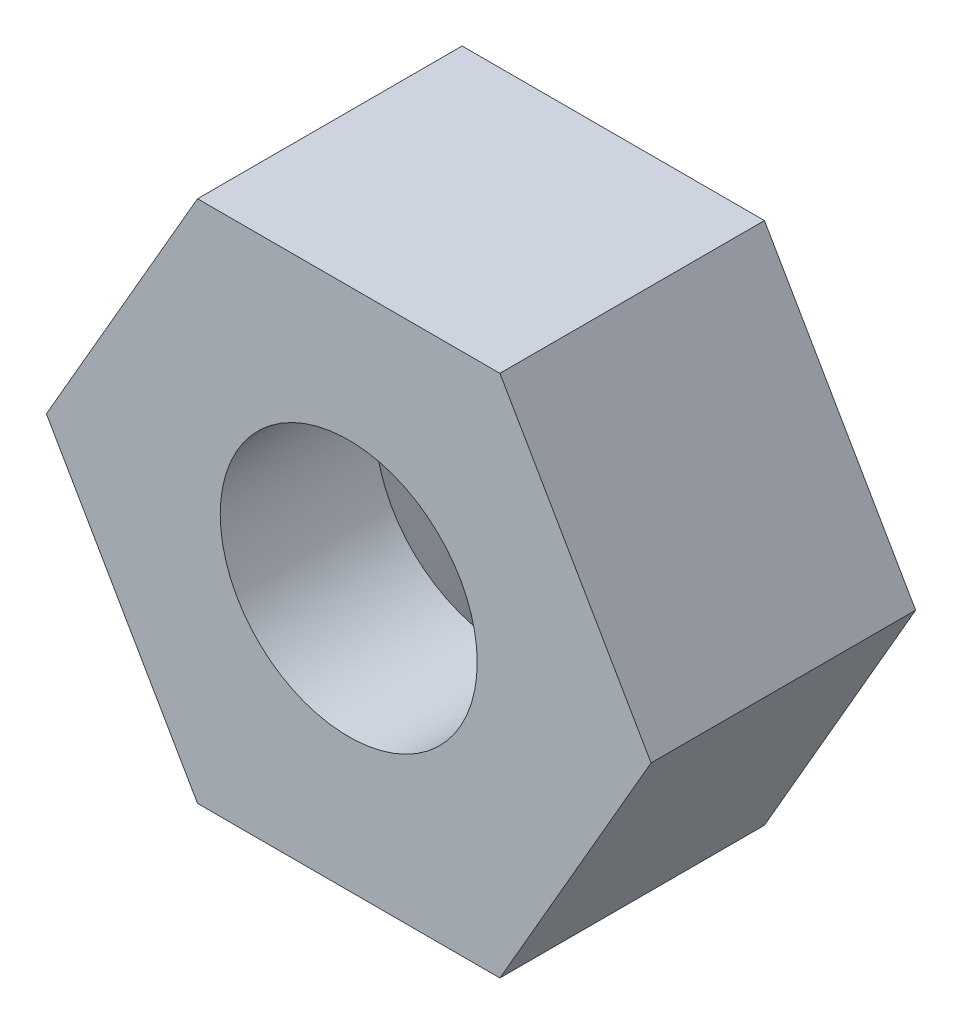
ISO-10303-21;
HEADER;
FILE_DESCRIPTION(('STEP AP214'),'2;1');
FILE_NAME('part.step','',(''),(''),'','','');
FILE_SCHEMA(('AUTOMOTIVE_DESIGN { 1 0 10303 214 1 1 1 1 }'));
ENDSEC;
DATA;
#1=APPLICATION_CONTEXT('core data for automotive mechanical design processes');
#2=APPLICATION_PROTOCOL_DEFINITION('international standard','automotive_design',2000,#1);
#3=PRODUCT_CONTEXT('',#1,'mechanical');
#4=PRODUCT('Part','Part','',(#3));
#5=PRODUCT_RELATED_PRODUCT_CATEGORY('part','',(#4));
#6=PRODUCT_DEFINITION_FORMATION('','',#4);
#7=PRODUCT_DEFINITION_CONTEXT('part definition',#1,'design');
#8=PRODUCT_DEFINITION('design','',#6,#7);
#9=PRODUCT_DEFINITION_SHAPE('','',#8);
#10=(LENGTH_UNIT() NAMED_UNIT(*) SI_UNIT(.MILLI.,.METRE.));
#11=(NAMED_UNIT(*) PLANE_ANGLE_UNIT() SI_UNIT($,.RADIAN.));
#12=(NAMED_UNIT(*) SI_UNIT($,.STERADIAN.) SOLID_ANGLE_UNIT());
#13=UNCERTAINTY_MEASURE_WITH_UNIT(LENGTH_MEASURE(1.E-05),#10,'distance_accuracy_value','');
#14=(GEOMETRIC_REPRESENTATION_CONTEXT(3) GLOBAL_UNCERTAINTY_ASSIGNED_CONTEXT((#13)) GLOBAL_UNIT_ASSIGNED_CONTEXT((#10,
#11,#12)) REPRESENTATION_CONTEXT('',''));
#15=CARTESIAN_POINT('',(0.,0.,0.));
#16=DIRECTION('',(0.,0.,1.));
#17=DIRECTION('',(1.,0.,0.));
#18=AXIS2_PLACEMENT_3D('',#15,#16,#17);
#19=CARTESIAN_POINT('',(0.,0.,-1.75));
#20=DIRECTION('',(0.,0.,1.));
#21=DIRECTION('',(1.,0.,0.));
#22=AXIS2_PLACEMENT_3D('',#19,#20,#21);
#23=PLANE('',#22);
#24=DIRECTION('',(1.,0.,0.));
#25=VECTOR('',#24,1.);
#26=CARTESIAN_POINT('',(-2.,-3.46410161513775,-1.75));
#27=LINE('',#26,#25);
#28=CARTESIAN_POINT('',(-2.,-3.46410161513775,-1.75));
#29=VERTEX_POINT('',#28);
#30=CARTESIAN_POINT('',(2.,-3.46410161513775,-1.75));
#31=VERTEX_POINT('',#30);
#32=EDGE_CURVE('E128',#29,#31,#27,.T.);
#33=ORIENTED_EDGE('',*,*,#32,.F.);
#34=DIRECTION('',(0.5,-0.866025403784439,0.));
#35=VECTOR('',#34,1.);
#36=CARTESIAN_POINT('',(-4.,0.,-1.75));
#37=LINE('',#36,#35);
#38=CARTESIAN_POINT('',(-4.,0.,-1.75));
#39=VERTEX_POINT('',#38);
#40=EDGE_CURVE('E89',#39,#29,#37,.T.);
#41=ORIENTED_EDGE('',*,*,#40,.F.);
#42=DIRECTION('',(-0.5,-0.866025403784439,0.));
#43=VECTOR('',#42,1.);
#44=CARTESIAN_POINT('',(-2.,3.46410161513775,-1.75));
#45=LINE('',#44,#43);
#46=CARTESIAN_POINT('',(-2.,3.46410161513775,-1.75));
#47=VERTEX_POINT('',#46);
#48=EDGE_CURVE('E83',#47,#39,#45,.T.);
#49=ORIENTED_EDGE('',*,*,#48,.F.);
#50=DIRECTION('',(-1.,0.,0.));
#51=VECTOR('',#50,1.);
#52=CARTESIAN_POINT('',(2.,3.46410161513775,-1.75));
#53=LINE('',#52,#51);
#54=CARTESIAN_POINT('',(2.,3.46410161513775,-1.75));
#55=VERTEX_POINT('',#54);
#56=EDGE_CURVE('E118',#55,#47,#53,.T.);
#57=ORIENTED_EDGE('',*,*,#56,.F.);
#58=DIRECTION('',(-0.5,0.866025403784439,0.));
#59=VECTOR('',#58,1.);
#60=CARTESIAN_POINT('',(4.,0.,-1.75));
#61=LINE('',#60,#59);
#62=CARTESIAN_POINT('',(4.,0.,-1.75));
#63=VERTEX_POINT('',#62);
#64=EDGE_CURVE('E134',#63,#55,#61,.T.);
#65=ORIENTED_EDGE('',*,*,#64,.F.);
#66=DIRECTION('',(0.5,0.866025403784439,0.));
#67=VECTOR('',#66,1.);
#68=CARTESIAN_POINT('',(2.,-3.46410161513775,-1.75));
#69=LINE('',#68,#67);
#70=EDGE_CURVE('E131',#31,#63,#69,.T.);
#71=ORIENTED_EDGE('',*,*,#70,.F.);
#72=EDGE_LOOP('',(#33,#41,#49,#57,#65,#71));
#73=FACE_BOUND('',#72,.T.);
#74=CARTESIAN_POINT('',(0.,0.,-1.75));
#75=DIRECTION('',(0.,0.,-1.));
#76=DIRECTION('',(-1.,0.,0.));
#77=AXIS2_PLACEMENT_3D('',#74,#75,#76);
#78=CIRCLE('',#77,3.15);
#79=CARTESIAN_POINT('',(-3.15,0.,-1.75));
#80=VERTEX_POINT('',#79);
#81=EDGE_CURVE('E184',#80,#80,#78,.T.);
#82=ORIENTED_EDGE('',*,*,#81,.F.);
#83=EDGE_LOOP('',(#82));
#84=FACE_BOUND('',#83,.T.);
#85=ADVANCED_FACE('F43',(#73,#84),#23,.F.);
#86=CARTESIAN_POINT('',(-2.,-3.46410161513775,1.75));
#87=DIRECTION('',(0.,1.,0.));
#88=DIRECTION('',(-1.,0.,0.));
#89=AXIS2_PLACEMENT_3D('',#86,#87,#88);
#90=PLANE('',#89);
#91=ORIENTED_EDGE('',*,*,#32,.T.);
#92=DIRECTION('',(0.,0.,-1.));
#93=VECTOR('',#92,1.);
#94=CARTESIAN_POINT('',(2.,-3.46410161513775,1.75));
#95=LINE('',#94,#93);
#96=CARTESIAN_POINT('',(2.,-3.46410161513775,1.75));
#97=VERTEX_POINT('',#96);
#98=EDGE_CURVE('E11',#97,#31,#95,.T.);
#99=ORIENTED_EDGE('',*,*,#98,.F.);
#100=DIRECTION('',(1.,0.,0.));
#101=VECTOR('',#100,1.);
#102=CARTESIAN_POINT('',(-2.,-3.46410161513775,1.75));
#103=LINE('',#102,#101);
#104=CARTESIAN_POINT('',(-2.,-3.46410161513775,1.75));
#105=VERTEX_POINT('',#104);
#106=EDGE_CURVE('E139',#105,#97,#103,.T.);
#107=ORIENTED_EDGE('',*,*,#106,.F.);
#108=DIRECTION('',(0.,0.,-1.));
#109=VECTOR('',#108,1.);
#110=CARTESIAN_POINT('',(-2.,-3.46410161513775,1.75));
#111=LINE('',#110,#109);
#112=EDGE_CURVE('E124',#105,#29,#111,.T.);
#113=ORIENTED_EDGE('',*,*,#112,.T.);
#114=EDGE_LOOP('',(#91,#99,#107,#113));
#115=FACE_BOUND('',#114,.T.);
#116=ADVANCED_FACE('F45',(#115),#90,.F.);
#117=CARTESIAN_POINT('',(2.,-3.46410161513775,1.75));
#118=DIRECTION('',(-0.866025403784439,0.5,0.));
#119=DIRECTION('',(-0.5,-0.866025403784439,0.));
#120=AXIS2_PLACEMENT_3D('',#117,#118,#119);
#121=PLANE('',#120);
#122=ORIENTED_EDGE('',*,*,#70,.T.);
#123=DIRECTION('',(0.,0.,-1.));
#124=VECTOR('',#123,1.);
#125=CARTESIAN_POINT('',(4.,0.,1.75));
#126=LINE('',#125,#124);
#127=CARTESIAN_POINT('',(4.,0.,1.75));
#128=VERTEX_POINT('',#127);
#129=EDGE_CURVE('E52',#128,#63,#126,.T.);
#130=ORIENTED_EDGE('',*,*,#129,.F.);
#131=DIRECTION('',(0.5,0.866025403784439,0.));
#132=VECTOR('',#131,1.);
#133=CARTESIAN_POINT('',(2.,-3.46410161513775,1.75));
#134=LINE('',#133,#132);
#135=EDGE_CURVE('E97',#97,#128,#134,.T.);
#136=ORIENTED_EDGE('',*,*,#135,.F.);
#137=ORIENTED_EDGE('',*,*,#98,.T.);
#138=EDGE_LOOP('',(#122,#130,#136,#137));
#139=FACE_BOUND('',#138,.T.);
#140=ADVANCED_FACE('F168',(#139),#121,.F.);
#141=CARTESIAN_POINT('',(4.,0.,1.75));
#142=DIRECTION('',(-0.866025403784439,-0.5,0.));
#143=DIRECTION('',(0.5,-0.866025403784439,0.));
#144=AXIS2_PLACEMENT_3D('',#141,#142,#143);
#145=PLANE('',#144);
#146=ORIENTED_EDGE('',*,*,#64,.T.);
#147=DIRECTION('',(0.,0.,-1.));
#148=VECTOR('',#147,1.);
#149=CARTESIAN_POINT('',(2.,3.46410161513775,1.75));
#150=LINE('',#149,#148);
#151=CARTESIAN_POINT('',(2.,3.46410161513775,1.75));
#152=VERTEX_POINT('',#151);
#153=EDGE_CURVE('E119',#152,#55,#150,.T.);
#154=ORIENTED_EDGE('',*,*,#153,.F.);
#155=DIRECTION('',(-0.5,0.866025403784439,0.));
#156=VECTOR('',#155,1.);
#157=CARTESIAN_POINT('',(4.,0.,1.75));
#158=LINE('',#157,#156);
#159=EDGE_CURVE('E110',#128,#152,#158,.T.);
#160=ORIENTED_EDGE('',*,*,#159,.F.);
#161=ORIENTED_EDGE('',*,*,#129,.T.);
#162=EDGE_LOOP('',(#146,#154,#160,#161));
#163=FACE_BOUND('',#162,.T.);
#164=ADVANCED_FACE('F145',(#163),#145,.F.);
#165=CARTESIAN_POINT('',(2.,3.46410161513775,1.75));
#166=DIRECTION('',(0.,-1.,0.));
#167=DIRECTION('',(1.,0.,0.));
#168=AXIS2_PLACEMENT_3D('',#165,#166,#167);
#169=PLANE('',#168);
#170=ORIENTED_EDGE('',*,*,#56,.T.);
#171=DIRECTION('',(0.,0.,-1.));
#172=VECTOR('',#171,1.);
#173=CARTESIAN_POINT('',(-2.,3.46410161513775,1.75));
#174=LINE('',#173,#172);
#175=CARTESIAN_POINT('',(-2.,3.46410161513775,1.75));
#176=VERTEX_POINT('',#175);
#177=EDGE_CURVE('E115',#176,#47,#174,.T.);
#178=ORIENTED_EDGE('',*,*,#177,.F.);
#179=DIRECTION('',(-1.,0.,0.));
#180=VECTOR('',#179,1.);
#181=CARTESIAN_POINT('',(2.,3.46410161513775,1.75));
#182=LINE('',#181,#180);
#183=EDGE_CURVE('E104',#152,#176,#182,.T.);
#184=ORIENTED_EDGE('',*,*,#183,.F.);
#185=ORIENTED_EDGE('',*,*,#153,.T.);
#186=EDGE_LOOP('',(#170,#178,#184,#185));
#187=FACE_BOUND('',#186,.T.);
#188=ADVANCED_FACE('F116',(#187),#169,.F.);
#189=CARTESIAN_POINT('',(-2.,3.46410161513775,1.75));
#190=DIRECTION('',(0.866025403784438,-0.5,0.));
#191=DIRECTION('',(0.5,0.866025403784439,0.));
#192=AXIS2_PLACEMENT_3D('',#189,#190,#191);
#193=PLANE('',#192);
#194=ORIENTED_EDGE('',*,*,#48,.T.);
#195=DIRECTION('',(0.,0.,-1.));
#196=VECTOR('',#195,1.);
#197=CARTESIAN_POINT('',(-4.,0.,1.75));
#198=LINE('',#197,#196);
#199=CARTESIAN_POINT('',(-4.,0.,1.75));
#200=VERTEX_POINT('',#199);
#201=EDGE_CURVE('E120',#200,#39,#198,.T.);
#202=ORIENTED_EDGE('',*,*,#201,.F.);
#203=DIRECTION('',(-0.5,-0.866025403784439,0.));
#204=VECTOR('',#203,1.);
#205=CARTESIAN_POINT('',(-2.,3.46410161513775,1.75));
#206=LINE('',#205,#204);
#207=EDGE_CURVE('E108',#176,#200,#206,.T.);
#208=ORIENTED_EDGE('',*,*,#207,.F.);
#209=ORIENTED_EDGE('',*,*,#177,.T.);
#210=EDGE_LOOP('',(#194,#202,#208,#209));
#211=FACE_BOUND('',#210,.T.);
#212=ADVANCED_FACE('F122',(#211),#193,.F.);
#213=CARTESIAN_POINT('',(-4.,0.,1.75));
#214=DIRECTION('',(0.866025403784439,0.5,0.));
#215=DIRECTION('',(-0.5,0.866025403784439,0.));
#216=AXIS2_PLACEMENT_3D('',#213,#214,#215);
#217=PLANE('',#216);
#218=ORIENTED_EDGE('',*,*,#40,.T.);
#219=ORIENTED_EDGE('',*,*,#112,.F.);
#220=DIRECTION('',(0.5,-0.866025403784439,0.));
#221=VECTOR('',#220,1.);
#222=CARTESIAN_POINT('',(-4.,0.,1.75));
#223=LINE('',#222,#221);
#224=EDGE_CURVE('E60',#200,#105,#223,.T.);
#225=ORIENTED_EDGE('',*,*,#224,.F.);
#226=ORIENTED_EDGE('',*,*,#201,.T.);
#227=EDGE_LOOP('',(#218,#219,#225,#226));
#228=FACE_BOUND('',#227,.T.);
#229=ADVANCED_FACE('F152',(#228),#217,.F.);
#230=CARTESIAN_POINT('',(0.,0.,1.75));
#231=DIRECTION('',(0.,0.,1.));
#232=DIRECTION('',(1.,0.,0.));
#233=AXIS2_PLACEMENT_3D('',#230,#231,#232);
#234=PLANE('',#233);
#235=CARTESIAN_POINT('',(0.,0.,1.75));
#236=DIRECTION('',(0.,0.,-1.));
#237=DIRECTION('',(-1.,0.,0.));
#238=AXIS2_PLACEMENT_3D('',#235,#236,#237);
#239=CIRCLE('',#238,1.7);
#240=CARTESIAN_POINT('',(-1.7,0.,1.75));
#241=VERTEX_POINT('',#240);
#242=EDGE_CURVE('E132',#241,#241,#239,.T.);
#243=ORIENTED_EDGE('',*,*,#242,.T.);
#244=EDGE_LOOP('',(#243));
#245=FACE_BOUND('',#244,.T.);
#246=ORIENTED_EDGE('',*,*,#106,.T.);
#247=ORIENTED_EDGE('',*,*,#135,.T.);
#248=ORIENTED_EDGE('',*,*,#159,.T.);
#249=ORIENTED_EDGE('',*,*,#183,.T.);
#250=ORIENTED_EDGE('',*,*,#207,.T.);
#251=ORIENTED_EDGE('',*,*,#224,.T.);
#252=EDGE_LOOP('',(#246,#247,#248,#249,#250,#251));
#253=FACE_BOUND('',#252,.T.);
#254=ADVANCED_FACE('F106',(#245,#253),#234,.T.);
#255=CARTESIAN_POINT('',(0.,0.,-1.75));
#256=DIRECTION('',(0.,0.,-1.));
#257=DIRECTION('',(-1.,0.,0.));
#258=AXIS2_PLACEMENT_3D('',#255,#256,#257);
#259=CYLINDRICAL_SURFACE('',#258,1.69999999999999);
#260=ORIENTED_EDGE('',*,*,#242,.F.);
#261=EDGE_LOOP('',(#260));
#262=FACE_BOUND('',#261,.T.);
#263=CARTESIAN_POINT('',(0.,0.,-0.299999999999993));
#264=DIRECTION('',(0.,0.,-1.));
#265=DIRECTION('',(-1.,0.,0.));
#266=AXIS2_PLACEMENT_3D('',#263,#264,#265);
#267=CIRCLE('',#266,1.69999999999999);
#268=CARTESIAN_POINT('',(-1.69999999999999,0.,-0.299999999999993));
#269=VERTEX_POINT('',#268);
#270=EDGE_CURVE('E181',#269,#269,#267,.T.);
#271=ORIENTED_EDGE('',*,*,#270,.T.);
#272=EDGE_LOOP('',(#271));
#273=FACE_BOUND('',#272,.T.);
#274=ADVANCED_FACE('F160',(#262,#273),#259,.F.);
#275=CARTESIAN_POINT('',(0.,0.,-1.75));
#276=DIRECTION('',(0.,0.,-1.));
#277=DIRECTION('',(-1.,0.,0.));
#278=AXIS2_PLACEMENT_3D('',#275,#276,#277);
#279=CONICAL_SURFACE('',#278,3.15,0.78539816339745);
#280=ORIENTED_EDGE('',*,*,#270,.F.);
#281=EDGE_LOOP('',(#280));
#282=FACE_BOUND('',#281,.T.);
#283=ORIENTED_EDGE('',*,*,#81,.T.);
#284=EDGE_LOOP('',(#283));
#285=FACE_BOUND('',#284,.T.);
#286=ADVANCED_FACE('F172',(#282,#285),#279,.F.);
#287=CLOSED_SHELL('',(#85,#116,#140,#164,#188,#212,#229,#254,#274,#286));
#288=MANIFOLD_SOLID_BREP('B2',#287);
#289=ADVANCED_BREP_SHAPE_REPRESENTATION('',(#18,#288),#14);
#290=SHAPE_DEFINITION_REPRESENTATION(#9,#289);
ENDSEC;
END-ISO-10303-21;
